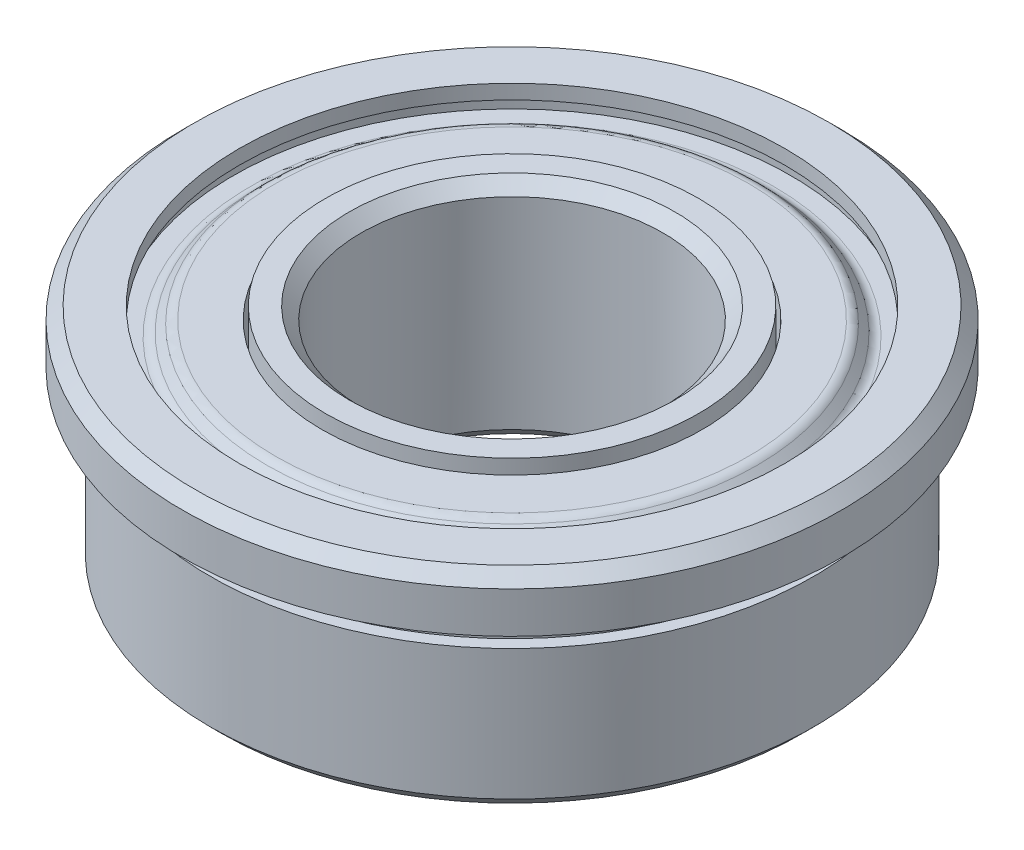
ISO-10303-21;
HEADER;
FILE_DESCRIPTION(('STEP AP214'),'2;1');
FILE_NAME('part.step','',(''),(''),'','','');
FILE_SCHEMA(('AUTOMOTIVE_DESIGN { 1 0 10303 214 1 1 1 1 }'));
ENDSEC;
DATA;
#1=APPLICATION_CONTEXT('core data for automotive mechanical design processes');
#2=APPLICATION_PROTOCOL_DEFINITION('international standard','automotive_design',2000,#1);
#3=PRODUCT_CONTEXT('',#1,'mechanical');
#4=PRODUCT('Part','Part','',(#3));
#5=PRODUCT_RELATED_PRODUCT_CATEGORY('part','',(#4));
#6=PRODUCT_DEFINITION_FORMATION('','',#4);
#7=PRODUCT_DEFINITION_CONTEXT('part definition',#1,'design');
#8=PRODUCT_DEFINITION('design','',#6,#7);
#9=PRODUCT_DEFINITION_SHAPE('','',#8);
#10=(LENGTH_UNIT() NAMED_UNIT(*) SI_UNIT(.MILLI.,.METRE.));
#11=(NAMED_UNIT(*) PLANE_ANGLE_UNIT() SI_UNIT($,.RADIAN.));
#12=(NAMED_UNIT(*) SI_UNIT($,.STERADIAN.) SOLID_ANGLE_UNIT());
#13=UNCERTAINTY_MEASURE_WITH_UNIT(LENGTH_MEASURE(1.E-05),#10,'distance_accuracy_value','');
#14=(GEOMETRIC_REPRESENTATION_CONTEXT(3) GLOBAL_UNCERTAINTY_ASSIGNED_CONTEXT((#13)) GLOBAL_UNIT_ASSIGNED_CONTEXT((#10,
#11,#12)) REPRESENTATION_CONTEXT('',''));
#15=CARTESIAN_POINT('',(0.,0.,0.));
#16=DIRECTION('',(0.,0.,1.));
#17=DIRECTION('',(1.,0.,0.));
#18=AXIS2_PLACEMENT_3D('',#15,#16,#17);
#19=CARTESIAN_POINT('',(0.,4.7498,0.));
#20=DIRECTION('',(0.,1.,0.));
#21=DIRECTION('',(0.,0.,1.));
#22=AXIS2_PLACEMENT_3D('',#19,#20,#21);
#23=PLANE('',#22);
#24=CARTESIAN_POINT('',(0.,4.74979999995639,0.));
#25=DIRECTION('',(0.,1.,0.));
#26=DIRECTION('',(0.,0.,1.));
#27=AXIS2_PLACEMENT_3D('',#24,#25,#26);
#28=CIRCLE('',#27,3.42899999998281);
#29=CARTESIAN_POINT('',(0.,4.74979999995639,3.42899999998281));
#30=VERTEX_POINT('',#29);
#31=EDGE_CURVE('E20',#30,#30,#28,.F.);
#32=ORIENTED_EDGE('',*,*,#31,.T.);
#33=EDGE_LOOP('',(#32));
#34=FACE_BOUND('',#33,.T.);
#35=CARTESIAN_POINT('',(0.,4.7498,0.));
#36=DIRECTION('',(0.,1.,0.));
#37=DIRECTION('',(0.,0.,1.));
#38=AXIS2_PLACEMENT_3D('',#35,#36,#37);
#39=CIRCLE('',#38,3.9243);
#40=CARTESIAN_POINT('',(0.,4.7498,3.9243));
#41=VERTEX_POINT('',#40);
#42=EDGE_CURVE('E128',#41,#41,#39,.F.);
#43=ORIENTED_EDGE('',*,*,#42,.F.);
#44=EDGE_LOOP('',(#43));
#45=FACE_BOUND('',#44,.T.);
#46=ADVANCED_FACE('F17',(#34,#45),#23,.T.);
#47=CARTESIAN_POINT('',(0.,4.74979999995639,0.));
#48=DIRECTION('',(0.,1.,0.));
#49=DIRECTION('',(0.,0.,1.));
#50=AXIS2_PLACEMENT_3D('',#47,#48,#49);
#51=CONICAL_SURFACE('',#50,3.42899999998281,0.785398163397448);
#52=ORIENTED_EDGE('',*,*,#31,.F.);
#53=EDGE_LOOP('',(#52));
#54=FACE_BOUND('',#53,.T.);
#55=CARTESIAN_POINT('',(0.,4.4958,0.));
#56=DIRECTION('',(0.,1.,0.));
#57=DIRECTION('',(0.,0.,1.));
#58=AXIS2_PLACEMENT_3D('',#55,#56,#57);
#59=CIRCLE('',#58,3.175);
#60=CARTESIAN_POINT('',(0.,4.4958,3.175));
#61=VERTEX_POINT('',#60);
#62=EDGE_CURVE('E127',#61,#61,#59,.F.);
#63=ORIENTED_EDGE('',*,*,#62,.T.);
#64=EDGE_LOOP('',(#63));
#65=FACE_BOUND('',#64,.T.);
#66=ADVANCED_FACE('F139',(#54,#65),#51,.F.);
#67=CARTESIAN_POINT('',(0.,4.4958,0.));
#68=DIRECTION('',(0.,1.,0.));
#69=DIRECTION('',(0.,0.,1.));
#70=AXIS2_PLACEMENT_3D('',#67,#68,#69);
#71=CYLINDRICAL_SURFACE('',#70,3.9243);
#72=CARTESIAN_POINT('',(0.,3.2258,0.));
#73=DIRECTION('',(0.,1.,0.));
#74=DIRECTION('',(0.,0.,1.));
#75=AXIS2_PLACEMENT_3D('',#72,#73,#74);
#76=CIRCLE('',#75,3.9243);
#77=CARTESIAN_POINT('',(0.,3.2258,3.9243));
#78=VERTEX_POINT('',#77);
#79=EDGE_CURVE('E125',#78,#78,#76,.F.);
#80=ORIENTED_EDGE('',*,*,#79,.F.);
#81=EDGE_LOOP('',(#80));
#82=FACE_BOUND('',#81,.T.);
#83=ORIENTED_EDGE('',*,*,#42,.T.);
#84=EDGE_LOOP('',(#83));
#85=FACE_BOUND('',#84,.T.);
#86=ADVANCED_FACE('F142',(#82,#85),#71,.T.);
#87=CARTESIAN_POINT('',(0.,0.,0.));
#88=DIRECTION('',(0.,1.,0.));
#89=DIRECTION('',(0.,0.,1.));
#90=AXIS2_PLACEMENT_3D('',#87,#88,#89);
#91=CYLINDRICAL_SURFACE('',#90,3.175);
#92=ORIENTED_EDGE('',*,*,#62,.F.);
#93=EDGE_LOOP('',(#92));
#94=FACE_BOUND('',#93,.T.);
#95=CARTESIAN_POINT('',(0.,0.253999999983989,0.));
#96=DIRECTION('',(0.,-1.,0.));
#97=DIRECTION('',(0.,0.,-1.));
#98=AXIS2_PLACEMENT_3D('',#95,#96,#97);
#99=CIRCLE('',#98,3.17499999999882);
#100=CARTESIAN_POINT('',(0.,0.253999999983989,-3.17499999999882));
#101=VERTEX_POINT('',#100);
#102=EDGE_CURVE('E124',#101,#101,#99,.T.);
#103=ORIENTED_EDGE('',*,*,#102,.T.);
#104=EDGE_LOOP('',(#103));
#105=FACE_BOUND('',#104,.T.);
#106=ADVANCED_FACE('F145',(#94,#105),#91,.F.);
#107=CARTESIAN_POINT('',(0.,3.2258,0.));
#108=DIRECTION('',(0.,1.,0.));
#109=DIRECTION('',(0.,0.,1.));
#110=AXIS2_PLACEMENT_3D('',#107,#108,#109);
#111=PLANE('',#110);
#112=ORIENTED_EDGE('',*,*,#79,.T.);
#113=EDGE_LOOP('',(#112));
#114=FACE_BOUND('',#113,.T.);
#115=CARTESIAN_POINT('',(0.,3.2258,0.));
#116=DIRECTION('',(0.,1.,0.));
#117=DIRECTION('',(0.,0.,1.));
#118=AXIS2_PLACEMENT_3D('',#115,#116,#117);
#119=CIRCLE('',#118,4.0005);
#120=CARTESIAN_POINT('',(0.,3.2258,4.0005));
#121=VERTEX_POINT('',#120);
#122=EDGE_CURVE('E121',#121,#121,#119,.T.);
#123=ORIENTED_EDGE('',*,*,#122,.T.);
#124=EDGE_LOOP('',(#123));
#125=FACE_BOUND('',#124,.T.);
#126=ADVANCED_FACE('F148',(#114,#125),#111,.T.);
#127=CARTESIAN_POINT('',(0.,1.13686837721616E-10,0.));
#128=DIRECTION('',(0.,-1.,0.));
#129=DIRECTION('',(0.,0.,-1.));
#130=AXIS2_PLACEMENT_3D('',#127,#128,#129);
#131=CONICAL_SURFACE('',#130,3.42899999992596,0.785398163397448);
#132=CARTESIAN_POINT('',(0.,5.6843418860808E-11,0.));
#133=DIRECTION('',(0.,-1.,0.));
#134=DIRECTION('',(0.,0.,-1.));
#135=AXIS2_PLACEMENT_3D('',#132,#133,#134);
#136=CIRCLE('',#135,3.42899999998281);
#137=CARTESIAN_POINT('',(0.,5.6843418860808E-11,-3.42899999998281));
#138=VERTEX_POINT('',#137);
#139=EDGE_CURVE('E118',#138,#138,#136,.T.);
#140=ORIENTED_EDGE('',*,*,#139,.T.);
#141=EDGE_LOOP('',(#140));
#142=FACE_BOUND('',#141,.T.);
#143=ORIENTED_EDGE('',*,*,#102,.F.);
#144=EDGE_LOOP('',(#143));
#145=FACE_BOUND('',#144,.T.);
#146=ADVANCED_FACE('F644',(#142,#145),#131,.F.);
#147=CARTESIAN_POINT('',(0.,3.2258,0.));
#148=DIRECTION('',(0.,1.,0.));
#149=DIRECTION('',(0.,0.,1.));
#150=AXIS2_PLACEMENT_3D('',#147,#148,#149);
#151=CYLINDRICAL_SURFACE('',#150,4.0005);
#152=CARTESIAN_POINT('',(0.,4.4958,0.));
#153=DIRECTION('',(0.,1.,0.));
#154=DIRECTION('',(0.,0.,1.));
#155=AXIS2_PLACEMENT_3D('',#152,#153,#154);
#156=CIRCLE('',#155,4.0005);
#157=CARTESIAN_POINT('',(0.,4.4958,4.0005));
#158=VERTEX_POINT('',#157);
#159=EDGE_CURVE('E115',#158,#158,#156,.F.);
#160=ORIENTED_EDGE('',*,*,#159,.F.);
#161=EDGE_LOOP('',(#160));
#162=FACE_BOUND('',#161,.T.);
#163=ORIENTED_EDGE('',*,*,#122,.F.);
#164=EDGE_LOOP('',(#163));
#165=FACE_BOUND('',#164,.T.);
#166=ADVANCED_FACE('F635',(#162,#165),#151,.F.);
#167=CARTESIAN_POINT('',(0.,0.,0.));
#168=DIRECTION('',(0.,1.,0.));
#169=DIRECTION('',(0.,0.,1.));
#170=AXIS2_PLACEMENT_3D('',#167,#168,#169);
#171=PLANE('',#170);
#172=ORIENTED_EDGE('',*,*,#139,.F.);
#173=EDGE_LOOP('',(#172));
#174=FACE_BOUND('',#173,.T.);
#175=CARTESIAN_POINT('',(0.,0.,0.));
#176=DIRECTION('',(0.,-1.,0.));
#177=DIRECTION('',(0.,0.,-1.));
#178=AXIS2_PLACEMENT_3D('',#175,#176,#177);
#179=CIRCLE('',#178,3.9243);
#180=CARTESIAN_POINT('',(0.,0.,-3.9243));
#181=VERTEX_POINT('',#180);
#182=EDGE_CURVE('E63',#181,#181,#179,.F.);
#183=ORIENTED_EDGE('',*,*,#182,.F.);
#184=EDGE_LOOP('',(#183));
#185=FACE_BOUND('',#184,.T.);
#186=ADVANCED_FACE('F627',(#174,#185),#171,.F.);
#187=CARTESIAN_POINT('',(0.,4.4958,0.));
#188=DIRECTION('',(0.,1.,0.));
#189=DIRECTION('',(0.,0.,1.));
#190=AXIS2_PLACEMENT_3D('',#187,#188,#189);
#191=PLANE('',#190);
#192=ORIENTED_EDGE('',*,*,#159,.T.);
#193=EDGE_LOOP('',(#192));
#194=FACE_BOUND('',#193,.T.);
#195=CARTESIAN_POINT('',(0.,4.4958,0.));
#196=DIRECTION('',(0.,-1.,0.));
#197=DIRECTION('',(0.,0.,-1.));
#198=AXIS2_PLACEMENT_3D('',#195,#196,#197);
#199=CIRCLE('',#198,4.97478975515723);
#200=CARTESIAN_POINT('',(0.,4.4958,-4.97478975515723));
#201=VERTEX_POINT('',#200);
#202=CARTESIAN_POINT('',(0.,4.4958,4.97478975515723));
#203=VERTEX_POINT('',#202);
#204=EDGE_CURVE('E58',#201,#203,#199,.T.);
#205=ORIENTED_EDGE('',*,*,#204,.F.);
#206=CARTESIAN_POINT('',(0.,4.4958,0.));
#207=DIRECTION('',(0.,-1.,0.));
#208=DIRECTION('',(0.,0.,1.));
#209=AXIS2_PLACEMENT_3D('',#206,#207,#208);
#210=CIRCLE('',#209,4.97478975515723);
#211=EDGE_CURVE('E55',#203,#201,#210,.T.);
#212=ORIENTED_EDGE('',*,*,#211,.F.);
#213=EDGE_LOOP('',(#205,#212));
#214=FACE_BOUND('',#213,.T.);
#215=ADVANCED_FACE('F60',(#194,#214),#191,.T.);
#216=CARTESIAN_POINT('',(0.,0.254,0.));
#217=DIRECTION('',(0.,-1.,0.));
#218=DIRECTION('',(0.,0.,-1.));
#219=AXIS2_PLACEMENT_3D('',#216,#217,#218);
#220=CYLINDRICAL_SURFACE('',#219,3.9243);
#221=CARTESIAN_POINT('',(0.,1.524,0.));
#222=DIRECTION('',(0.,-1.,0.));
#223=DIRECTION('',(0.,0.,-1.));
#224=AXIS2_PLACEMENT_3D('',#221,#222,#223);
#225=CIRCLE('',#224,3.9243);
#226=CARTESIAN_POINT('',(0.,1.524,-3.9243));
#227=VERTEX_POINT('',#226);
#228=EDGE_CURVE('E68',#227,#227,#225,.F.);
#229=ORIENTED_EDGE('',*,*,#228,.F.);
#230=EDGE_LOOP('',(#229));
#231=FACE_BOUND('',#230,.T.);
#232=ORIENTED_EDGE('',*,*,#182,.T.);
#233=EDGE_LOOP('',(#232));
#234=FACE_BOUND('',#233,.T.);
#235=ADVANCED_FACE('F89',(#231,#234),#220,.T.);
#236=CARTESIAN_POINT('',(0.,4.2418,0.));
#237=DIRECTION('',(0.,1.,0.));
#238=DIRECTION('',(0.,0.,1.));
#239=AXIS2_PLACEMENT_3D('',#236,#237,#238);
#240=TOROIDAL_SURFACE('',#239,4.97478975515723,0.254);
#241=CARTESIAN_POINT('',(0.,4.4214051224003,0.));
#242=DIRECTION('',(0.,-1.,0.));
#243=DIRECTION('',(0.,0.,-1.));
#244=AXIS2_PLACEMENT_3D('',#241,#242,#243);
#245=CIRCLE('',#244,5.15439487753611);
#246=CARTESIAN_POINT('',(0.,4.4214051224003,-5.15439487753611));
#247=VERTEX_POINT('',#246);
#248=EDGE_CURVE('E99',#247,#247,#245,.T.);
#249=ORIENTED_EDGE('',*,*,#248,.F.);
#250=EDGE_LOOP('',(#249));
#251=FACE_BOUND('',#250,.T.);
#252=ORIENTED_EDGE('',*,*,#211,.T.);
#253=ORIENTED_EDGE('',*,*,#204,.T.);
#254=EDGE_LOOP('',(#252,#253));
#255=FACE_BOUND('',#254,.T.);
#256=ADVANCED_FACE('F67',(#251,#255),#240,.T.);
#257=CARTESIAN_POINT('',(0.,1.524,0.));
#258=DIRECTION('',(0.,-1.,0.));
#259=DIRECTION('',(0.,0.,-1.));
#260=AXIS2_PLACEMENT_3D('',#257,#258,#259);
#261=PLANE('',#260);
#262=ORIENTED_EDGE('',*,*,#228,.T.);
#263=EDGE_LOOP('',(#262));
#264=FACE_BOUND('',#263,.T.);
#265=CARTESIAN_POINT('',(0.,1.524,0.));
#266=DIRECTION('',(0.,-1.,0.));
#267=DIRECTION('',(0.,0.,-1.));
#268=AXIS2_PLACEMENT_3D('',#265,#266,#267);
#269=CIRCLE('',#268,4.0005);
#270=CARTESIAN_POINT('',(0.,1.524,-4.0005));
#271=VERTEX_POINT('',#270);
#272=EDGE_CURVE('E101',#271,#271,#269,.T.);
#273=ORIENTED_EDGE('',*,*,#272,.T.);
#274=EDGE_LOOP('',(#273));
#275=FACE_BOUND('',#274,.T.);
#276=ADVANCED_FACE('F88',(#264,#275),#261,.T.);
#277=CARTESIAN_POINT('',(0.,4.26539487756372,0.));
#278=DIRECTION('',(0.,-1.,0.));
#279=DIRECTION('',(0.,0.,-1.));
#280=AXIS2_PLACEMENT_3D('',#277,#278,#279);
#281=CONICAL_SURFACE('',#280,5.31040512237269,0.785398163397448);
#282=ORIENTED_EDGE('',*,*,#248,.T.);
#283=EDGE_LOOP('',(#282));
#284=FACE_BOUND('',#283,.T.);
#285=CARTESIAN_POINT('',(0.,4.2653948775786,0.));
#286=DIRECTION('',(0.,-1.,0.));
#287=DIRECTION('',(0.,0.,-1.));
#288=AXIS2_PLACEMENT_3D('',#285,#286,#287);
#289=CIRCLE('',#288,5.3104051224214);
#290=CARTESIAN_POINT('',(0.,4.2653948775786,-5.3104051224214));
#291=VERTEX_POINT('',#290);
#292=EDGE_CURVE('E105',#291,#291,#289,.F.);
#293=ORIENTED_EDGE('',*,*,#292,.T.);
#294=EDGE_LOOP('',(#293));
#295=FACE_BOUND('',#294,.T.);
#296=ADVANCED_FACE('F239',(#284,#295),#281,.T.);
#297=CARTESIAN_POINT('',(0.,1.524,0.));
#298=DIRECTION('',(0.,-1.,0.));
#299=DIRECTION('',(0.,0.,-1.));
#300=AXIS2_PLACEMENT_3D('',#297,#298,#299);
#301=CYLINDRICAL_SURFACE('',#300,4.0005);
#302=CARTESIAN_POINT('',(0.,0.254,0.));
#303=DIRECTION('',(0.,-1.,0.));
#304=DIRECTION('',(0.,0.,-1.));
#305=AXIS2_PLACEMENT_3D('',#302,#303,#304);
#306=CIRCLE('',#305,4.0005);
#307=CARTESIAN_POINT('',(0.,0.254,-4.0005));
#308=VERTEX_POINT('',#307);
#309=EDGE_CURVE('E200',#308,#308,#306,.F.);
#310=ORIENTED_EDGE('',*,*,#309,.F.);
#311=EDGE_LOOP('',(#310));
#312=FACE_BOUND('',#311,.T.);
#313=ORIENTED_EDGE('',*,*,#272,.F.);
#314=EDGE_LOOP('',(#313));
#315=FACE_BOUND('',#314,.T.);
#316=ADVANCED_FACE('F233',(#312,#315),#301,.F.);
#317=CARTESIAN_POINT('',(0.,4.445,0.));
#318=DIRECTION('',(0.,-1.,0.));
#319=DIRECTION('',(0.,0.,-1.));
#320=AXIS2_PLACEMENT_3D('',#317,#318,#319);
#321=TOROIDAL_SURFACE('',#320,5.49001024484277,0.254);
#322=ORIENTED_EDGE('',*,*,#292,.F.);
#323=EDGE_LOOP('',(#322));
#324=FACE_BOUND('',#323,.T.);
#325=CARTESIAN_POINT('',(0.,4.191,0.));
#326=DIRECTION('',(0.,1.,0.));
#327=DIRECTION('',(0.,0.,-1.));
#328=AXIS2_PLACEMENT_3D('',#325,#326,#327);
#329=CIRCLE('',#328,5.49001024484277);
#330=CARTESIAN_POINT('',(0.,4.191,-5.49001024484277));
#331=VERTEX_POINT('',#330);
#332=CARTESIAN_POINT('',(0.,4.191,5.49001024484277));
#333=VERTEX_POINT('',#332);
#334=EDGE_CURVE('E202',#331,#333,#329,.T.);
#335=ORIENTED_EDGE('',*,*,#334,.T.);
#336=CARTESIAN_POINT('',(0.,4.191,0.));
#337=DIRECTION('',(0.,1.,0.));
#338=DIRECTION('',(0.,0.,1.));
#339=AXIS2_PLACEMENT_3D('',#336,#337,#338);
#340=CIRCLE('',#339,5.49001024484277);
#341=EDGE_CURVE('E205',#333,#331,#340,.T.);
#342=ORIENTED_EDGE('',*,*,#341,.T.);
#343=EDGE_LOOP('',(#335,#342));
#344=FACE_BOUND('',#343,.T.);
#345=ADVANCED_FACE('F222',(#324,#344),#321,.F.);
#346=CARTESIAN_POINT('',(0.,0.254,0.));
#347=DIRECTION('',(0.,-1.,0.));
#348=DIRECTION('',(0.,0.,-1.));
#349=AXIS2_PLACEMENT_3D('',#346,#347,#348);
#350=PLANE('',#349);
#351=ORIENTED_EDGE('',*,*,#309,.T.);
#352=EDGE_LOOP('',(#351));
#353=FACE_BOUND('',#352,.T.);
#354=CARTESIAN_POINT('',(0.,0.254,0.));
#355=DIRECTION('',(0.,1.,0.));
#356=DIRECTION('',(0.,0.,1.));
#357=AXIS2_PLACEMENT_3D('',#354,#355,#356);
#358=CIRCLE('',#357,4.97478975515723);
#359=CARTESIAN_POINT('',(0.,0.254,4.97478975515723));
#360=VERTEX_POINT('',#359);
#361=CARTESIAN_POINT('',(0.,0.254,-4.97478975515723));
#362=VERTEX_POINT('',#361);
#363=EDGE_CURVE('E397',#360,#362,#358,.T.);
#364=ORIENTED_EDGE('',*,*,#363,.F.);
#365=CARTESIAN_POINT('',(0.,0.254,0.));
#366=DIRECTION('',(0.,1.,0.));
#367=DIRECTION('',(0.,0.,-1.));
#368=AXIS2_PLACEMENT_3D('',#365,#366,#367);
#369=CIRCLE('',#368,4.97478975515723);
#370=EDGE_CURVE('E199',#362,#360,#369,.T.);
#371=ORIENTED_EDGE('',*,*,#370,.F.);
#372=EDGE_LOOP('',(#364,#371));
#373=FACE_BOUND('',#372,.T.);
#374=ADVANCED_FACE('F232',(#353,#373),#350,.T.);
#375=CARTESIAN_POINT('',(0.,4.191,5.7404));
#376=DIRECTION('',(0.,-1.,0.));
#377=DIRECTION('',(0.,0.,-1.));
#378=AXIS2_PLACEMENT_3D('',#375,#376,#377);
#379=PLANE('',#378);
#380=ORIENTED_EDGE('',*,*,#334,.F.);
#381=ORIENTED_EDGE('',*,*,#341,.F.);
#382=EDGE_LOOP('',(#380,#381));
#383=FACE_BOUND('',#382,.T.);
#384=CARTESIAN_POINT('',(0.,4.191,0.));
#385=DIRECTION('',(0.,1.,0.));
#386=DIRECTION('',(0.,0.,1.));
#387=AXIS2_PLACEMENT_3D('',#384,#385,#386);
#388=CIRCLE('',#387,5.8674);
#389=CARTESIAN_POINT('',(0.,4.191,5.8674));
#390=VERTEX_POINT('',#389);
#391=EDGE_CURVE('E197',#390,#390,#388,.T.);
#392=ORIENTED_EDGE('',*,*,#391,.T.);
#393=EDGE_LOOP('',(#392));
#394=FACE_BOUND('',#393,.T.);
#395=ADVANCED_FACE('F364',(#383,#394),#379,.F.);
#396=CARTESIAN_POINT('',(0.,0.508,0.));
#397=DIRECTION('',(0.,-1.,0.));
#398=DIRECTION('',(0.,0.,-1.));
#399=AXIS2_PLACEMENT_3D('',#396,#397,#398);
#400=TOROIDAL_SURFACE('',#399,4.97478975515723,0.254);
#401=CARTESIAN_POINT('',(0.,0.328394877612936,0.));
#402=DIRECTION('',(0.,1.,0.));
#403=DIRECTION('',(0.,0.,-1.));
#404=AXIS2_PLACEMENT_3D('',#401,#402,#403);
#405=CIRCLE('',#404,5.15439487753611);
#406=CARTESIAN_POINT('',(0.,0.328394877612936,-5.15439487753611));
#407=VERTEX_POINT('',#406);
#408=EDGE_CURVE('E196',#407,#407,#405,.T.);
#409=ORIENTED_EDGE('',*,*,#408,.F.);
#410=EDGE_LOOP('',(#409));
#411=FACE_BOUND('',#410,.T.);
#412=ORIENTED_EDGE('',*,*,#370,.T.);
#413=ORIENTED_EDGE('',*,*,#363,.T.);
#414=EDGE_LOOP('',(#412,#413));
#415=FACE_BOUND('',#414,.T.);
#416=ADVANCED_FACE('F356',(#411,#415),#400,.T.);
#417=CARTESIAN_POINT('',(0.,0.,0.));
#418=DIRECTION('',(0.,1.,0.));
#419=DIRECTION('',(0.,0.,1.));
#420=AXIS2_PLACEMENT_3D('',#417,#418,#419);
#421=CYLINDRICAL_SURFACE('',#420,5.8674);
#422=CARTESIAN_POINT('',(0.,4.445,0.));
#423=DIRECTION('',(0.,1.,0.));
#424=DIRECTION('',(0.,0.,1.));
#425=AXIS2_PLACEMENT_3D('',#422,#423,#424);
#426=CIRCLE('',#425,5.8674);
#427=CARTESIAN_POINT('',(0.,4.445,5.8674));
#428=VERTEX_POINT('',#427);
#429=EDGE_CURVE('E193',#428,#428,#426,.T.);
#430=ORIENTED_EDGE('',*,*,#429,.T.);
#431=EDGE_LOOP('',(#430));
#432=FACE_BOUND('',#431,.T.);
#433=ORIENTED_EDGE('',*,*,#391,.F.);
#434=EDGE_LOOP('',(#433));
#435=FACE_BOUND('',#434,.T.);
#436=ADVANCED_FACE('F349',(#432,#435),#421,.F.);
#437=CARTESIAN_POINT('',(0.,0.484405122449516,0.));
#438=DIRECTION('',(0.,1.,0.));
#439=DIRECTION('',(-1.,0.,0.));
#440=AXIS2_PLACEMENT_3D('',#437,#438,#439);
#441=CONICAL_SURFACE('',#440,5.31040512237269,0.785398163397448);
#442=ORIENTED_EDGE('',*,*,#408,.T.);
#443=EDGE_LOOP('',(#442));
#444=FACE_BOUND('',#443,.T.);
#445=CARTESIAN_POINT('',(0.,0.484405122421389,0.));
#446=DIRECTION('',(0.,1.,0.));
#447=DIRECTION('',(0.,0.,1.));
#448=AXIS2_PLACEMENT_3D('',#445,#446,#447);
#449=CIRCLE('',#448,5.31040512242139);
#450=CARTESIAN_POINT('',(0.,0.484405122421389,5.31040512242139));
#451=VERTEX_POINT('',#450);
#452=EDGE_CURVE('E192',#451,#451,#449,.F.);
#453=ORIENTED_EDGE('',*,*,#452,.T.);
#454=EDGE_LOOP('',(#453));
#455=FACE_BOUND('',#454,.T.);
#456=ADVANCED_FACE('F347',(#444,#455),#441,.T.);
#457=CARTESIAN_POINT('',(-5.7404,4.445,0.));
#458=DIRECTION('',(0.,1.,0.));
#459=DIRECTION('',(0.,0.,1.));
#460=AXIS2_PLACEMENT_3D('',#457,#458,#459);
#461=PLANE('',#460);
#462=CARTESIAN_POINT('',(0.,4.445,0.));
#463=DIRECTION('',(0.,1.,0.));
#464=DIRECTION('',(0.,0.,1.));
#465=AXIS2_PLACEMENT_3D('',#462,#463,#464);
#466=CIRCLE('',#465,5.7404);
#467=CARTESIAN_POINT('',(0.,4.445,5.7404));
#468=VERTEX_POINT('',#467);
#469=EDGE_CURVE('E189',#468,#468,#466,.T.);
#470=ORIENTED_EDGE('',*,*,#469,.T.);
#471=EDGE_LOOP('',(#470));
#472=FACE_BOUND('',#471,.T.);
#473=ORIENTED_EDGE('',*,*,#429,.F.);
#474=EDGE_LOOP('',(#473));
#475=FACE_BOUND('',#474,.T.);
#476=ADVANCED_FACE('F339',(#472,#475),#461,.F.);
#477=CARTESIAN_POINT('',(0.,0.3048,0.));
#478=DIRECTION('',(0.,1.,0.));
#479=DIRECTION('',(0.,0.,1.));
#480=AXIS2_PLACEMENT_3D('',#477,#478,#479);
#481=TOROIDAL_SURFACE('',#480,5.49001024484277,0.254);
#482=ORIENTED_EDGE('',*,*,#452,.F.);
#483=EDGE_LOOP('',(#482));
#484=FACE_BOUND('',#483,.T.);
#485=CARTESIAN_POINT('',(0.,0.5588,0.));
#486=DIRECTION('',(0.,-1.,0.));
#487=DIRECTION('',(0.,0.,1.));
#488=AXIS2_PLACEMENT_3D('',#485,#486,#487);
#489=CIRCLE('',#488,5.49001024484277);
#490=CARTESIAN_POINT('',(0.,0.5588,5.49001024484277));
#491=VERTEX_POINT('',#490);
#492=CARTESIAN_POINT('',(0.,0.5588,-5.49001024484277));
#493=VERTEX_POINT('',#492);
#494=EDGE_CURVE('E34',#491,#493,#489,.T.);
#495=ORIENTED_EDGE('',*,*,#494,.T.);
#496=CARTESIAN_POINT('',(0.,0.5588,0.));
#497=DIRECTION('',(0.,-1.,0.));
#498=DIRECTION('',(0.,0.,-1.));
#499=AXIS2_PLACEMENT_3D('',#496,#497,#498);
#500=CIRCLE('',#499,5.49001024484277);
#501=EDGE_CURVE('E188',#493,#491,#500,.T.);
#502=ORIENTED_EDGE('',*,*,#501,.T.);
#503=EDGE_LOOP('',(#495,#502));
#504=FACE_BOUND('',#503,.T.);
#505=ADVANCED_FACE('F323',(#484,#504),#481,.F.);
#506=CARTESIAN_POINT('',(0.,4.4958,0.));
#507=DIRECTION('',(0.,1.,0.));
#508=DIRECTION('',(0.,0.,1.));
#509=AXIS2_PLACEMENT_3D('',#506,#507,#508);
#510=CYLINDRICAL_SURFACE('',#509,5.7404);
#511=CARTESIAN_POINT('',(0.,4.7498,0.));
#512=DIRECTION('',(0.,1.,0.));
#513=DIRECTION('',(0.,0.,1.));
#514=AXIS2_PLACEMENT_3D('',#511,#512,#513);
#515=CIRCLE('',#514,5.7404);
#516=CARTESIAN_POINT('',(0.,4.7498,5.7404));
#517=VERTEX_POINT('',#516);
#518=EDGE_CURVE('E185',#517,#517,#515,.F.);
#519=ORIENTED_EDGE('',*,*,#518,.F.);
#520=EDGE_LOOP('',(#519));
#521=FACE_BOUND('',#520,.T.);
#522=ORIENTED_EDGE('',*,*,#469,.F.);
#523=EDGE_LOOP('',(#522));
#524=FACE_BOUND('',#523,.T.);
#525=ADVANCED_FACE('F302',(#521,#524),#510,.F.);
#526=CARTESIAN_POINT('',(0.,0.5588,5.7404));
#527=DIRECTION('',(0.,1.,0.));
#528=DIRECTION('',(0.,0.,1.));
#529=AXIS2_PLACEMENT_3D('',#526,#527,#528);
#530=PLANE('',#529);
#531=ORIENTED_EDGE('',*,*,#494,.F.);
#532=ORIENTED_EDGE('',*,*,#501,.F.);
#533=EDGE_LOOP('',(#531,#532));
#534=FACE_BOUND('',#533,.T.);
#535=CARTESIAN_POINT('',(0.,0.558800000000003,0.));
#536=DIRECTION('',(0.,-1.,0.));
#537=DIRECTION('',(0.,0.,-1.));
#538=AXIS2_PLACEMENT_3D('',#535,#536,#537);
#539=CIRCLE('',#538,5.8674);
#540=CARTESIAN_POINT('',(0.,0.558800000000003,-5.8674));
#541=VERTEX_POINT('',#540);
#542=EDGE_CURVE('E182',#541,#541,#539,.T.);
#543=ORIENTED_EDGE('',*,*,#542,.T.);
#544=EDGE_LOOP('',(#543));
#545=FACE_BOUND('',#544,.T.);
#546=ADVANCED_FACE('F297',(#534,#545),#530,.F.);
#547=CARTESIAN_POINT('',(0.,4.7498,0.));
#548=DIRECTION('',(0.,1.,0.));
#549=DIRECTION('',(0.,0.,1.));
#550=AXIS2_PLACEMENT_3D('',#547,#548,#549);
#551=PLANE('',#550);
#552=ORIENTED_EDGE('',*,*,#518,.T.);
#553=EDGE_LOOP('',(#552));
#554=FACE_BOUND('',#553,.T.);
#555=CARTESIAN_POINT('',(0.,4.74980000001324,0.));
#556=DIRECTION('',(0.,-1.,0.));
#557=DIRECTION('',(0.,0.,-1.));
#558=AXIS2_PLACEMENT_3D('',#555,#556,#557);
#559=CIRCLE('',#558,6.68020000000524);
#560=CARTESIAN_POINT('',(0.,4.74980000001324,-6.68020000000524));
#561=VERTEX_POINT('',#560);
#562=EDGE_CURVE('E179',#561,#561,#559,.T.);
#563=ORIENTED_EDGE('',*,*,#562,.F.);
#564=EDGE_LOOP('',(#563));
#565=FACE_BOUND('',#564,.T.);
#566=ADVANCED_FACE('F293',(#554,#565),#551,.T.);
#567=CARTESIAN_POINT('',(0.,4.7498,0.));
#568=DIRECTION('',(0.,-1.,0.));
#569=DIRECTION('',(0.,0.,-1.));
#570=AXIS2_PLACEMENT_3D('',#567,#568,#569);
#571=CYLINDRICAL_SURFACE('',#570,5.8674);
#572=CARTESIAN_POINT('',(0.,0.3048,0.));
#573=DIRECTION('',(0.,-1.,0.));
#574=DIRECTION('',(0.,0.,-1.));
#575=AXIS2_PLACEMENT_3D('',#572,#573,#574);
#576=CIRCLE('',#575,5.8674);
#577=CARTESIAN_POINT('',(0.,0.3048,-5.8674));
#578=VERTEX_POINT('',#577);
#579=EDGE_CURVE('E176',#578,#578,#576,.T.);
#580=ORIENTED_EDGE('',*,*,#579,.T.);
#581=EDGE_LOOP('',(#580));
#582=FACE_BOUND('',#581,.T.);
#583=ORIENTED_EDGE('',*,*,#542,.F.);
#584=EDGE_LOOP('',(#583));
#585=FACE_BOUND('',#584,.T.);
#586=ADVANCED_FACE('F289',(#582,#585),#571,.F.);
#587=CARTESIAN_POINT('',(0.,4.49580000008609,0.));
#588=DIRECTION('',(0.,-1.,0.));
#589=DIRECTION('',(0.,0.,-1.));
#590=AXIS2_PLACEMENT_3D('',#587,#588,#589);
#591=CONICAL_SURFACE('',#590,6.93419999993239,0.785398163397448);
#592=ORIENTED_EDGE('',*,*,#562,.T.);
#593=EDGE_LOOP('',(#592));
#594=FACE_BOUND('',#593,.T.);
#595=CARTESIAN_POINT('',(0.,4.4958,0.));
#596=DIRECTION('',(0.,-1.,0.));
#597=DIRECTION('',(0.,0.,-1.));
#598=AXIS2_PLACEMENT_3D('',#595,#596,#597);
#599=CIRCLE('',#598,6.9342);
#600=CARTESIAN_POINT('',(0.,4.4958,-6.9342));
#601=VERTEX_POINT('',#600);
#602=EDGE_CURVE('E175',#601,#601,#599,.T.);
#603=ORIENTED_EDGE('',*,*,#602,.F.);
#604=EDGE_LOOP('',(#603));
#605=FACE_BOUND('',#604,.T.);
#606=ADVANCED_FACE('F285',(#594,#605),#591,.T.);
#607=CARTESIAN_POINT('',(-5.7404,0.3048,0.));
#608=DIRECTION('',(0.,-1.,0.));
#609=DIRECTION('',(0.,0.,-1.));
#610=AXIS2_PLACEMENT_3D('',#607,#608,#609);
#611=PLANE('',#610);
#612=CARTESIAN_POINT('',(0.,0.3048,0.));
#613=DIRECTION('',(0.,-1.,0.));
#614=DIRECTION('',(0.,0.,-1.));
#615=AXIS2_PLACEMENT_3D('',#612,#613,#614);
#616=CIRCLE('',#615,5.7404);
#617=CARTESIAN_POINT('',(0.,0.3048,-5.7404));
#618=VERTEX_POINT('',#617);
#619=EDGE_CURVE('E172',#618,#618,#616,.T.);
#620=ORIENTED_EDGE('',*,*,#619,.T.);
#621=EDGE_LOOP('',(#620));
#622=FACE_BOUND('',#621,.T.);
#623=ORIENTED_EDGE('',*,*,#579,.F.);
#624=EDGE_LOOP('',(#623));
#625=FACE_BOUND('',#624,.T.);
#626=ADVANCED_FACE('F281',(#622,#625),#611,.F.);
#627=CARTESIAN_POINT('',(0.,4.7498,0.));
#628=DIRECTION('',(0.,-1.,0.));
#629=DIRECTION('',(0.,0.,-1.));
#630=AXIS2_PLACEMENT_3D('',#627,#628,#629);
#631=CYLINDRICAL_SURFACE('',#630,6.9342);
#632=ORIENTED_EDGE('',*,*,#602,.T.);
#633=EDGE_LOOP('',(#632));
#634=FACE_BOUND('',#633,.T.);
#635=CARTESIAN_POINT('',(0.,3.6322,0.));
#636=DIRECTION('',(0.,-1.,0.));
#637=DIRECTION('',(0.,0.,-1.));
#638=AXIS2_PLACEMENT_3D('',#635,#636,#637);
#639=CIRCLE('',#638,6.9342);
#640=CARTESIAN_POINT('',(0.,3.6322,-6.9342));
#641=VERTEX_POINT('',#640);
#642=EDGE_CURVE('E169',#641,#641,#639,.F.);
#643=ORIENTED_EDGE('',*,*,#642,.T.);
#644=EDGE_LOOP('',(#643));
#645=FACE_BOUND('',#644,.T.);
#646=ADVANCED_FACE('F277',(#634,#645),#631,.T.);
#647=CARTESIAN_POINT('',(0.,0.254,0.));
#648=DIRECTION('',(0.,-1.,0.));
#649=DIRECTION('',(0.,0.,-1.));
#650=AXIS2_PLACEMENT_3D('',#647,#648,#649);
#651=CYLINDRICAL_SURFACE('',#650,5.7404);
#652=CARTESIAN_POINT('',(0.,0.,0.));
#653=DIRECTION('',(0.,-1.,0.));
#654=DIRECTION('',(0.,0.,-1.));
#655=AXIS2_PLACEMENT_3D('',#652,#653,#654);
#656=CIRCLE('',#655,5.7404);
#657=CARTESIAN_POINT('',(0.,0.,-5.7404));
#658=VERTEX_POINT('',#657);
#659=EDGE_CURVE('E166',#658,#658,#656,.T.);
#660=ORIENTED_EDGE('',*,*,#659,.T.);
#661=EDGE_LOOP('',(#660));
#662=FACE_BOUND('',#661,.T.);
#663=ORIENTED_EDGE('',*,*,#619,.F.);
#664=EDGE_LOOP('',(#663));
#665=FACE_BOUND('',#664,.T.);
#666=ADVANCED_FACE('F273',(#662,#665),#651,.F.);
#667=CARTESIAN_POINT('',(0.,3.6322,0.));
#668=DIRECTION('',(0.,1.,0.));
#669=DIRECTION('',(0.,0.,1.));
#670=AXIS2_PLACEMENT_3D('',#667,#668,#669);
#671=PLANE('',#670);
#672=CARTESIAN_POINT('',(0.,3.6322,0.));
#673=DIRECTION('',(0.,1.,0.));
#674=DIRECTION('',(0.,0.,1.));
#675=AXIS2_PLACEMENT_3D('',#672,#673,#674);
#676=CIRCLE('',#675,6.096);
#677=CARTESIAN_POINT('',(0.,3.6322,6.096));
#678=VERTEX_POINT('',#677);
#679=EDGE_CURVE('E163',#678,#678,#676,.F.);
#680=ORIENTED_EDGE('',*,*,#679,.F.);
#681=EDGE_LOOP('',(#680));
#682=FACE_BOUND('',#681,.T.);
#683=ORIENTED_EDGE('',*,*,#642,.F.);
#684=EDGE_LOOP('',(#683));
#685=FACE_BOUND('',#684,.T.);
#686=ADVANCED_FACE('F269',(#682,#685),#671,.F.);
#687=CARTESIAN_POINT('',(0.,0.,0.));
#688=DIRECTION('',(0.,1.,0.));
#689=DIRECTION('',(0.,0.,1.));
#690=AXIS2_PLACEMENT_3D('',#687,#688,#689);
#691=PLANE('',#690);
#692=ORIENTED_EDGE('',*,*,#659,.F.);
#693=EDGE_LOOP('',(#692));
#694=FACE_BOUND('',#693,.T.);
#695=CARTESIAN_POINT('',(0.,0.,0.));
#696=DIRECTION('',(0.,1.,0.));
#697=DIRECTION('',(0.,0.,1.));
#698=AXIS2_PLACEMENT_3D('',#695,#696,#697);
#699=CIRCLE('',#698,6.09600000001365);
#700=CARTESIAN_POINT('',(0.,0.,6.09600000001365));
#701=VERTEX_POINT('',#700);
#702=EDGE_CURVE('E160',#701,#701,#699,.T.);
#703=ORIENTED_EDGE('',*,*,#702,.F.);
#704=EDGE_LOOP('',(#703));
#705=FACE_BOUND('',#704,.T.);
#706=ADVANCED_FACE('F265',(#694,#705),#691,.F.);
#707=CARTESIAN_POINT('',(0.,0.,0.));
#708=DIRECTION('',(0.,1.,0.));
#709=DIRECTION('',(0.,0.,1.));
#710=AXIS2_PLACEMENT_3D('',#707,#708,#709);
#711=CYLINDRICAL_SURFACE('',#710,6.096);
#712=CARTESIAN_POINT('',(0.,2.9972,0.));
#713=DIRECTION('',(0.,1.,0.));
#714=DIRECTION('',(0.,0.,1.));
#715=AXIS2_PLACEMENT_3D('',#712,#713,#714);
#716=CIRCLE('',#715,6.096);
#717=CARTESIAN_POINT('',(0.,2.9972,6.096));
#718=VERTEX_POINT('',#717);
#719=EDGE_CURVE('E157',#718,#718,#716,.F.);
#720=ORIENTED_EDGE('',*,*,#719,.F.);
#721=EDGE_LOOP('',(#720));
#722=FACE_BOUND('',#721,.T.);
#723=ORIENTED_EDGE('',*,*,#679,.T.);
#724=EDGE_LOOP('',(#723));
#725=FACE_BOUND('',#724,.T.);
#726=ADVANCED_FACE('F261',(#722,#725),#711,.T.);
#727=CARTESIAN_POINT('',(0.,0.254000000040833,0.));
#728=DIRECTION('',(0.,1.,0.));
#729=DIRECTION('',(0.,0.,1.));
#730=AXIS2_PLACEMENT_3D('',#727,#728,#729);
#731=CONICAL_SURFACE('',#730,6.35000000005448,0.785398163397448);
#732=ORIENTED_EDGE('',*,*,#702,.T.);
#733=EDGE_LOOP('',(#732));
#734=FACE_BOUND('',#733,.T.);
#735=CARTESIAN_POINT('',(0.,0.254000000000013,0.));
#736=DIRECTION('',(0.,-1.,0.));
#737=DIRECTION('',(0.,0.,-1.));
#738=AXIS2_PLACEMENT_3D('',#735,#736,#737);
#739=CIRCLE('',#738,6.35);
#740=CARTESIAN_POINT('',(0.,0.254000000000013,-6.35));
#741=VERTEX_POINT('',#740);
#742=EDGE_CURVE('E26',#741,#741,#739,.F.);
#743=ORIENTED_EDGE('',*,*,#742,.F.);
#744=EDGE_LOOP('',(#743));
#745=FACE_BOUND('',#744,.T.);
#746=ADVANCED_FACE('F254',(#734,#745),#731,.T.);
#747=CARTESIAN_POINT('',(6.35,2.9972,0.));
#748=DIRECTION('',(0.,1.,0.));
#749=DIRECTION('',(0.,0.,1.));
#750=AXIS2_PLACEMENT_3D('',#747,#748,#749);
#751=PLANE('',#750);
#752=ORIENTED_EDGE('',*,*,#719,.T.);
#753=EDGE_LOOP('',(#752));
#754=FACE_BOUND('',#753,.T.);
#755=CARTESIAN_POINT('',(0.,2.9972,0.));
#756=DIRECTION('',(0.,-1.,0.));
#757=DIRECTION('',(0.,0.,-1.));
#758=AXIS2_PLACEMENT_3D('',#755,#756,#757);
#759=CIRCLE('',#758,6.35);
#760=CARTESIAN_POINT('',(0.,2.9972,-6.35));
#761=VERTEX_POINT('',#760);
#762=EDGE_CURVE('E11',#761,#761,#759,.T.);
#763=ORIENTED_EDGE('',*,*,#762,.F.);
#764=EDGE_LOOP('',(#763));
#765=FACE_BOUND('',#764,.T.);
#766=ADVANCED_FACE('F248',(#754,#765),#751,.T.);
#767=CARTESIAN_POINT('',(0.,3.6322,0.));
#768=DIRECTION('',(0.,-1.,0.));
#769=DIRECTION('',(0.,0.,-1.));
#770=AXIS2_PLACEMENT_3D('',#767,#768,#769);
#771=CYLINDRICAL_SURFACE('',#770,6.35);
#772=ORIENTED_EDGE('',*,*,#762,.T.);
#773=EDGE_LOOP('',(#772));
#774=FACE_BOUND('',#773,.T.);
#775=ORIENTED_EDGE('',*,*,#742,.T.);
#776=EDGE_LOOP('',(#775));
#777=FACE_BOUND('',#776,.T.);
#778=ADVANCED_FACE('F246',(#774,#777),#771,.T.);
#779=CLOSED_SHELL('',(#46,#66,#86,#106,#126,#146,#166,#186,#215,#235,#256,#276,#296,#316,#345,
#374,#395,#416,#436,#456,#476,#505,#525,#546,#566,#586,#606,#626,#646,#666,#686,#706,#726,#746,
#766,#778));
#780=MANIFOLD_SOLID_BREP('B1',#779);
#781=ADVANCED_BREP_SHAPE_REPRESENTATION('',(#18,#780),#14);
#782=SHAPE_DEFINITION_REPRESENTATION(#9,#781);
ENDSEC;
END-ISO-10303-21;
